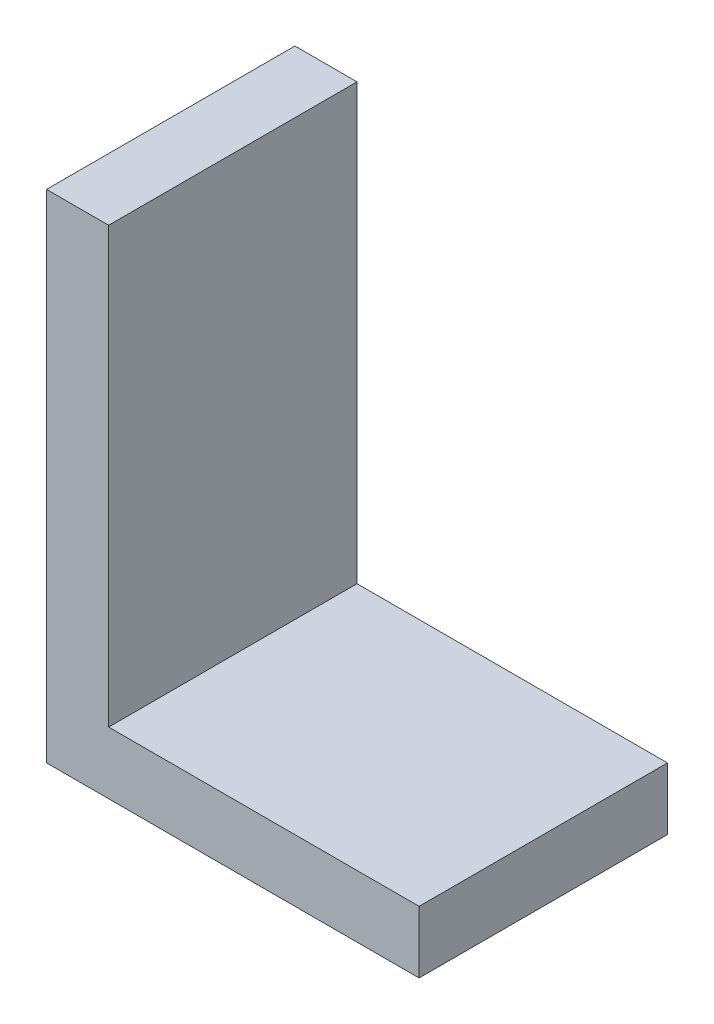
ISO-10303-21;
HEADER;
FILE_DESCRIPTION(('STEP AP214'),'2;1');
FILE_NAME('part.step','',(''),(''),'','','');
FILE_SCHEMA(('AUTOMOTIVE_DESIGN { 1 0 10303 214 1 1 1 1 }'));
ENDSEC;
DATA;
#1=APPLICATION_CONTEXT('core data for automotive mechanical design processes');
#2=APPLICATION_PROTOCOL_DEFINITION('international standard','automotive_design',2000,#1);
#3=PRODUCT_CONTEXT('',#1,'mechanical');
#4=PRODUCT('Part','Part','',(#3));
#5=PRODUCT_RELATED_PRODUCT_CATEGORY('part','',(#4));
#6=PRODUCT_DEFINITION_FORMATION('','',#4);
#7=PRODUCT_DEFINITION_CONTEXT('part definition',#1,'design');
#8=PRODUCT_DEFINITION('design','',#6,#7);
#9=PRODUCT_DEFINITION_SHAPE('','',#8);
#10=(LENGTH_UNIT() NAMED_UNIT(*) SI_UNIT(.MILLI.,.METRE.));
#11=(NAMED_UNIT(*) PLANE_ANGLE_UNIT() SI_UNIT($,.RADIAN.));
#12=(NAMED_UNIT(*) SI_UNIT($,.STERADIAN.) SOLID_ANGLE_UNIT());
#13=UNCERTAINTY_MEASURE_WITH_UNIT(LENGTH_MEASURE(1.E-05),#10,'distance_accuracy_value','');
#14=(GEOMETRIC_REPRESENTATION_CONTEXT(3) GLOBAL_UNCERTAINTY_ASSIGNED_CONTEXT((#13)) GLOBAL_UNIT_ASSIGNED_CONTEXT((#10,
#11,#12)) REPRESENTATION_CONTEXT('',''));
#15=CARTESIAN_POINT('',(0.,0.,0.));
#16=DIRECTION('',(0.,0.,1.));
#17=DIRECTION('',(1.,0.,0.));
#18=AXIS2_PLACEMENT_3D('',#15,#16,#17);
#19=CARTESIAN_POINT('',(30.,0.,-20.));
#20=DIRECTION('',(0.,-1.,0.));
#21=DIRECTION('',(1.,0.,0.));
#22=AXIS2_PLACEMENT_3D('',#19,#20,#21);
#23=PLANE('',#22);
#24=DIRECTION('',(1.,0.,0.));
#25=VECTOR('',#24,1.);
#26=CARTESIAN_POINT('',(30.,0.,0.));
#27=LINE('',#26,#25);
#28=CARTESIAN_POINT('',(0.,0.,0.));
#29=VERTEX_POINT('',#28);
#30=CARTESIAN_POINT('',(30.,0.,0.));
#31=VERTEX_POINT('',#30);
#32=EDGE_CURVE('E136',#29,#31,#27,.T.);
#33=ORIENTED_EDGE('',*,*,#32,.F.);
#34=DIRECTION('',(0.,0.,1.));
#35=VECTOR('',#34,1.);
#36=CARTESIAN_POINT('',(0.,0.,-20.));
#37=LINE('',#36,#35);
#38=CARTESIAN_POINT('',(0.,0.,-20.));
#39=VERTEX_POINT('',#38);
#40=EDGE_CURVE('E11',#39,#29,#37,.T.);
#41=ORIENTED_EDGE('',*,*,#40,.F.);
#42=DIRECTION('',(1.,0.,0.));
#43=VECTOR('',#42,1.);
#44=CARTESIAN_POINT('',(30.,0.,-20.));
#45=LINE('',#44,#43);
#46=CARTESIAN_POINT('',(30.,0.,-20.));
#47=VERTEX_POINT('',#46);
#48=EDGE_CURVE('E156',#39,#47,#45,.T.);
#49=ORIENTED_EDGE('',*,*,#48,.T.);
#50=DIRECTION('',(0.,0.,1.));
#51=VECTOR('',#50,1.);
#52=CARTESIAN_POINT('',(30.,0.,-20.));
#53=LINE('',#52,#51);
#54=EDGE_CURVE('E48',#47,#31,#53,.T.);
#55=ORIENTED_EDGE('',*,*,#54,.T.);
#56=EDGE_LOOP('',(#33,#41,#49,#55));
#57=FACE_BOUND('',#56,.T.);
#58=ADVANCED_FACE('F45',(#57),#23,.T.);
#59=CARTESIAN_POINT('',(0.,0.,-20.));
#60=DIRECTION('',(-1.,0.,0.));
#61=DIRECTION('',(0.,0.,1.));
#62=AXIS2_PLACEMENT_3D('',#59,#60,#61);
#63=PLANE('',#62);
#64=DIRECTION('',(0.,-1.,0.));
#65=VECTOR('',#64,1.);
#66=CARTESIAN_POINT('',(0.,0.,0.));
#67=LINE('',#66,#65);
#68=CARTESIAN_POINT('',(0.,40.,0.));
#69=VERTEX_POINT('',#68);
#70=EDGE_CURVE('E153',#69,#29,#67,.T.);
#71=ORIENTED_EDGE('',*,*,#70,.F.);
#72=DIRECTION('',(0.,0.,1.));
#73=VECTOR('',#72,1.);
#74=CARTESIAN_POINT('',(0.,40.,-20.));
#75=LINE('',#74,#73);
#76=CARTESIAN_POINT('',(0.,40.,-20.));
#77=VERTEX_POINT('',#76);
#78=EDGE_CURVE('E55',#77,#69,#75,.T.);
#79=ORIENTED_EDGE('',*,*,#78,.F.);
#80=DIRECTION('',(0.,-1.,0.));
#81=VECTOR('',#80,1.);
#82=CARTESIAN_POINT('',(0.,0.,-20.));
#83=LINE('',#82,#81);
#84=EDGE_CURVE('E122',#77,#39,#83,.T.);
#85=ORIENTED_EDGE('',*,*,#84,.T.);
#86=ORIENTED_EDGE('',*,*,#40,.T.);
#87=EDGE_LOOP('',(#71,#79,#85,#86));
#88=FACE_BOUND('',#87,.T.);
#89=ADVANCED_FACE('F168',(#88),#63,.T.);
#90=CARTESIAN_POINT('',(0.,40.,-20.));
#91=DIRECTION('',(0.,1.,0.));
#92=DIRECTION('',(0.,0.,1.));
#93=AXIS2_PLACEMENT_3D('',#90,#91,#92);
#94=PLANE('',#93);
#95=DIRECTION('',(-1.,0.,0.));
#96=VECTOR('',#95,1.);
#97=CARTESIAN_POINT('',(0.,40.,0.));
#98=LINE('',#97,#96);
#99=CARTESIAN_POINT('',(5.,40.,0.));
#100=VERTEX_POINT('',#99);
#101=EDGE_CURVE('E108',#100,#69,#98,.T.);
#102=ORIENTED_EDGE('',*,*,#101,.F.);
#103=DIRECTION('',(0.,0.,1.));
#104=VECTOR('',#103,1.);
#105=CARTESIAN_POINT('',(5.,40.,-20.));
#106=LINE('',#105,#104);
#107=CARTESIAN_POINT('',(5.,40.,-20.));
#108=VERTEX_POINT('',#107);
#109=EDGE_CURVE('E103',#108,#100,#106,.T.);
#110=ORIENTED_EDGE('',*,*,#109,.F.);
#111=DIRECTION('',(-1.,0.,0.));
#112=VECTOR('',#111,1.);
#113=CARTESIAN_POINT('',(0.,40.,-20.));
#114=LINE('',#113,#112);
#115=EDGE_CURVE('E106',#108,#77,#114,.T.);
#116=ORIENTED_EDGE('',*,*,#115,.T.);
#117=ORIENTED_EDGE('',*,*,#78,.T.);
#118=EDGE_LOOP('',(#102,#110,#116,#117));
#119=FACE_BOUND('',#118,.T.);
#120=ADVANCED_FACE('F105',(#119),#94,.T.);
#121=CARTESIAN_POINT('',(5.,40.,-20.));
#122=DIRECTION('',(1.,0.,0.));
#123=DIRECTION('',(0.,1.,0.));
#124=AXIS2_PLACEMENT_3D('',#121,#122,#123);
#125=PLANE('',#124);
#126=DIRECTION('',(0.,1.,0.));
#127=VECTOR('',#126,1.);
#128=CARTESIAN_POINT('',(5.,40.,0.));
#129=LINE('',#128,#127);
#130=CARTESIAN_POINT('',(5.,5.,0.));
#131=VERTEX_POINT('',#130);
#132=EDGE_CURVE('E148',#131,#100,#129,.T.);
#133=ORIENTED_EDGE('',*,*,#132,.F.);
#134=DIRECTION('',(0.,0.,1.));
#135=VECTOR('',#134,1.);
#136=CARTESIAN_POINT('',(5.,5.,-20.));
#137=LINE('',#136,#135);
#138=CARTESIAN_POINT('',(5.,5.,-20.));
#139=VERTEX_POINT('',#138);
#140=EDGE_CURVE('E114',#139,#131,#137,.T.);
#141=ORIENTED_EDGE('',*,*,#140,.F.);
#142=DIRECTION('',(0.,1.,0.));
#143=VECTOR('',#142,1.);
#144=CARTESIAN_POINT('',(5.,40.,-20.));
#145=LINE('',#144,#143);
#146=EDGE_CURVE('E120',#139,#108,#145,.T.);
#147=ORIENTED_EDGE('',*,*,#146,.T.);
#148=ORIENTED_EDGE('',*,*,#109,.T.);
#149=EDGE_LOOP('',(#133,#141,#147,#148));
#150=FACE_BOUND('',#149,.T.);
#151=ADVANCED_FACE('F125',(#150),#125,.T.);
#152=CARTESIAN_POINT('',(5.,5.,-20.));
#153=DIRECTION('',(0.,1.,0.));
#154=DIRECTION('',(-1.,0.,0.));
#155=AXIS2_PLACEMENT_3D('',#152,#153,#154);
#156=PLANE('',#155);
#157=DIRECTION('',(-1.,0.,0.));
#158=VECTOR('',#157,1.);
#159=CARTESIAN_POINT('',(5.,5.,0.));
#160=LINE('',#159,#158);
#161=CARTESIAN_POINT('',(30.,5.,0.));
#162=VERTEX_POINT('',#161);
#163=EDGE_CURVE('E144',#162,#131,#160,.T.);
#164=ORIENTED_EDGE('',*,*,#163,.F.);
#165=DIRECTION('',(0.,0.,1.));
#166=VECTOR('',#165,1.);
#167=CARTESIAN_POINT('',(30.,5.,-20.));
#168=LINE('',#167,#166);
#169=CARTESIAN_POINT('',(30.,5.,-20.));
#170=VERTEX_POINT('',#169);
#171=EDGE_CURVE('E161',#170,#162,#168,.T.);
#172=ORIENTED_EDGE('',*,*,#171,.F.);
#173=DIRECTION('',(-1.,0.,0.));
#174=VECTOR('',#173,1.);
#175=CARTESIAN_POINT('',(5.,5.,-20.));
#176=LINE('',#175,#174);
#177=EDGE_CURVE('E127',#170,#139,#176,.T.);
#178=ORIENTED_EDGE('',*,*,#177,.T.);
#179=ORIENTED_EDGE('',*,*,#140,.T.);
#180=EDGE_LOOP('',(#164,#172,#178,#179));
#181=FACE_BOUND('',#180,.T.);
#182=ADVANCED_FACE('F181',(#181),#156,.T.);
#183=CARTESIAN_POINT('',(30.,5.,-20.));
#184=DIRECTION('',(1.,0.,0.));
#185=DIRECTION('',(0.,0.,-1.));
#186=AXIS2_PLACEMENT_3D('',#183,#184,#185);
#187=PLANE('',#186);
#188=DIRECTION('',(0.,1.,0.));
#189=VECTOR('',#188,1.);
#190=CARTESIAN_POINT('',(30.,5.,0.));
#191=LINE('',#190,#189);
#192=EDGE_CURVE('E140',#31,#162,#191,.T.);
#193=ORIENTED_EDGE('',*,*,#192,.F.);
#194=ORIENTED_EDGE('',*,*,#54,.F.);
#195=DIRECTION('',(0.,1.,0.));
#196=VECTOR('',#195,1.);
#197=CARTESIAN_POINT('',(30.,5.,-20.));
#198=LINE('',#197,#196);
#199=EDGE_CURVE('E130',#47,#170,#198,.T.);
#200=ORIENTED_EDGE('',*,*,#199,.T.);
#201=ORIENTED_EDGE('',*,*,#171,.T.);
#202=EDGE_LOOP('',(#193,#194,#200,#201));
#203=FACE_BOUND('',#202,.T.);
#204=ADVANCED_FACE('F165',(#203),#187,.T.);
#205=CARTESIAN_POINT('',(0.,0.,-20.));
#206=DIRECTION('',(0.,0.,-1.));
#207=DIRECTION('',(-1.,0.,0.));
#208=AXIS2_PLACEMENT_3D('',#205,#206,#207);
#209=PLANE('',#208);
#210=ORIENTED_EDGE('',*,*,#48,.F.);
#211=ORIENTED_EDGE('',*,*,#84,.F.);
#212=ORIENTED_EDGE('',*,*,#115,.F.);
#213=ORIENTED_EDGE('',*,*,#146,.F.);
#214=ORIENTED_EDGE('',*,*,#177,.F.);
#215=ORIENTED_EDGE('',*,*,#199,.F.);
#216=EDGE_LOOP('',(#210,#211,#212,#213,#214,#215));
#217=FACE_BOUND('',#216,.T.);
#218=ADVANCED_FACE('F118',(#217),#209,.T.);
#219=CARTESIAN_POINT('',(0.,0.,0.));
#220=DIRECTION('',(0.,0.,-1.));
#221=DIRECTION('',(-1.,0.,0.));
#222=AXIS2_PLACEMENT_3D('',#219,#220,#221);
#223=PLANE('',#222);
#224=ORIENTED_EDGE('',*,*,#32,.T.);
#225=ORIENTED_EDGE('',*,*,#192,.T.);
#226=ORIENTED_EDGE('',*,*,#163,.T.);
#227=ORIENTED_EDGE('',*,*,#132,.T.);
#228=ORIENTED_EDGE('',*,*,#101,.T.);
#229=ORIENTED_EDGE('',*,*,#70,.T.);
#230=EDGE_LOOP('',(#224,#225,#226,#227,#228,#229));
#231=FACE_BOUND('',#230,.T.);
#232=ADVANCED_FACE('F167',(#231),#223,.F.);
#233=CLOSED_SHELL('',(#58,#89,#120,#151,#182,#204,#218,#232));
#234=MANIFOLD_SOLID_BREP('B2',#233);
#235=ADVANCED_BREP_SHAPE_REPRESENTATION('',(#18,#234),#14);
#236=SHAPE_DEFINITION_REPRESENTATION(#9,#235);
ENDSEC;
END-ISO-10303-21;
